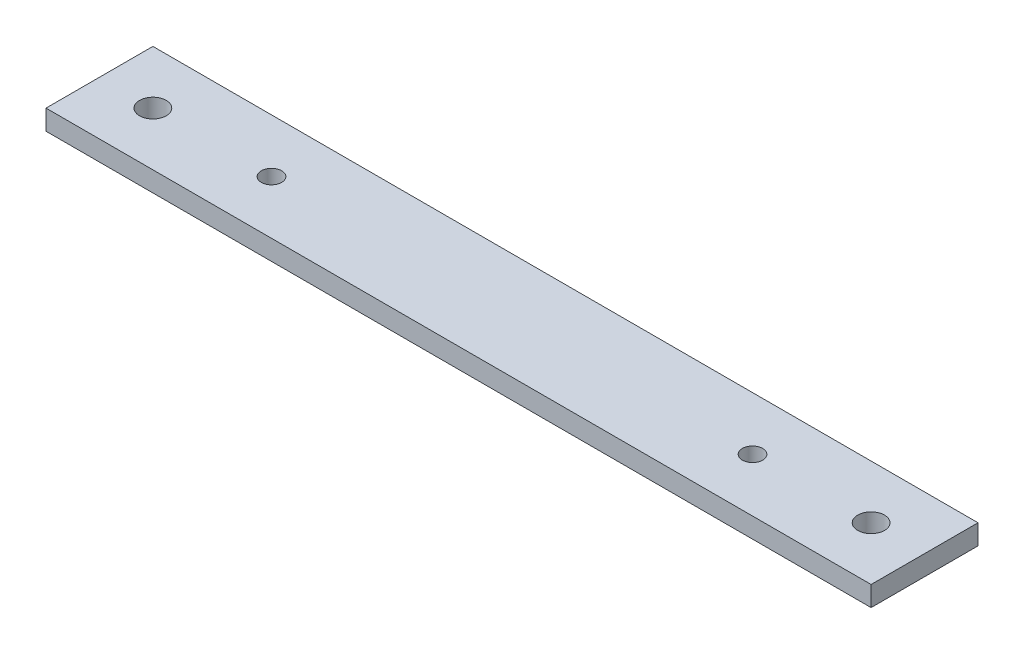
ISO-10303-21;
HEADER;
FILE_DESCRIPTION(('STEP AP214'),'2;1');
FILE_NAME('part.step','',(''),(''),'','','');
FILE_SCHEMA(('AUTOMOTIVE_DESIGN { 1 0 10303 214 1 1 1 1 }'));
ENDSEC;
DATA;
#1=APPLICATION_CONTEXT('core data for automotive mechanical design processes');
#2=APPLICATION_PROTOCOL_DEFINITION('international standard','automotive_design',2000,#1);
#3=PRODUCT_CONTEXT('',#1,'mechanical');
#4=PRODUCT('Part','Part','',(#3));
#5=PRODUCT_RELATED_PRODUCT_CATEGORY('part','',(#4));
#6=PRODUCT_DEFINITION_FORMATION('','',#4);
#7=PRODUCT_DEFINITION_CONTEXT('part definition',#1,'design');
#8=PRODUCT_DEFINITION('design','',#6,#7);
#9=PRODUCT_DEFINITION_SHAPE('','',#8);
#10=(LENGTH_UNIT() NAMED_UNIT(*) SI_UNIT(.MILLI.,.METRE.));
#11=(NAMED_UNIT(*) PLANE_ANGLE_UNIT() SI_UNIT($,.RADIAN.));
#12=(NAMED_UNIT(*) SI_UNIT($,.STERADIAN.) SOLID_ANGLE_UNIT());
#13=UNCERTAINTY_MEASURE_WITH_UNIT(LENGTH_MEASURE(1.E-05),#10,'distance_accuracy_value','');
#14=(GEOMETRIC_REPRESENTATION_CONTEXT(3) GLOBAL_UNCERTAINTY_ASSIGNED_CONTEXT((#13)) GLOBAL_UNIT_ASSIGNED_CONTEXT((#10,
#11,#12)) REPRESENTATION_CONTEXT('',''));
#15=CARTESIAN_POINT('',(0.,0.,0.));
#16=DIRECTION('',(0.,0.,1.));
#17=DIRECTION('',(1.,0.,0.));
#18=AXIS2_PLACEMENT_3D('',#15,#16,#17);
#19=CARTESIAN_POINT('',(-98.0313,4.7625,12.7));
#20=DIRECTION('',(1.,0.,0.));
#21=DIRECTION('',(0.,0.,-1.));
#22=AXIS2_PLACEMENT_3D('',#19,#20,#21);
#23=PLANE('',#22);
#24=DIRECTION('',(0.,0.,1.));
#25=VECTOR('',#24,1.);
#26=CARTESIAN_POINT('',(-98.0313,0.,12.7));
#27=LINE('',#26,#25);
#28=CARTESIAN_POINT('',(-98.0313,0.,-12.7));
#29=VERTEX_POINT('',#28);
#30=CARTESIAN_POINT('',(-98.0313,0.,12.7));
#31=VERTEX_POINT('',#30);
#32=EDGE_CURVE('E96',#29,#31,#27,.T.);
#33=ORIENTED_EDGE('',*,*,#32,.T.);
#34=DIRECTION('',(0.,-1.,0.));
#35=VECTOR('',#34,1.);
#36=CARTESIAN_POINT('',(-98.0313,4.7625,12.7));
#37=LINE('',#36,#35);
#38=CARTESIAN_POINT('',(-98.0313,4.7625,12.7));
#39=VERTEX_POINT('',#38);
#40=EDGE_CURVE('E11',#39,#31,#37,.T.);
#41=ORIENTED_EDGE('',*,*,#40,.F.);
#42=DIRECTION('',(0.,0.,1.));
#43=VECTOR('',#42,1.);
#44=CARTESIAN_POINT('',(-98.0313,4.7625,12.7));
#45=LINE('',#44,#43);
#46=CARTESIAN_POINT('',(-98.0313,4.7625,-12.7));
#47=VERTEX_POINT('',#46);
#48=EDGE_CURVE('E84',#47,#39,#45,.T.);
#49=ORIENTED_EDGE('',*,*,#48,.F.);
#50=DIRECTION('',(0.,-1.,0.));
#51=VECTOR('',#50,1.);
#52=CARTESIAN_POINT('',(-98.0313,4.7625,-12.7));
#53=LINE('',#52,#51);
#54=EDGE_CURVE('E92',#47,#29,#53,.T.);
#55=ORIENTED_EDGE('',*,*,#54,.T.);
#56=EDGE_LOOP('',(#33,#41,#49,#55));
#57=FACE_BOUND('',#56,.T.);
#58=ADVANCED_FACE('F33',(#57),#23,.F.);
#59=CARTESIAN_POINT('',(98.0313,4.7625,12.7));
#60=DIRECTION('',(0.,0.,-1.));
#61=DIRECTION('',(-1.,0.,0.));
#62=AXIS2_PLACEMENT_3D('',#59,#60,#61);
#63=PLANE('',#62);
#64=DIRECTION('',(1.,0.,0.));
#65=VECTOR('',#64,1.);
#66=CARTESIAN_POINT('',(98.0313,0.,12.7));
#67=LINE('',#66,#65);
#68=CARTESIAN_POINT('',(98.0313,0.,12.7));
#69=VERTEX_POINT('',#68);
#70=EDGE_CURVE('E88',#31,#69,#67,.T.);
#71=ORIENTED_EDGE('',*,*,#70,.T.);
#72=DIRECTION('',(0.,-1.,0.));
#73=VECTOR('',#72,1.);
#74=CARTESIAN_POINT('',(98.0313,4.7625,12.7));
#75=LINE('',#74,#73);
#76=CARTESIAN_POINT('',(98.0313,4.7625,12.7));
#77=VERTEX_POINT('',#76);
#78=EDGE_CURVE('E41',#77,#69,#75,.T.);
#79=ORIENTED_EDGE('',*,*,#78,.F.);
#80=DIRECTION('',(1.,0.,0.));
#81=VECTOR('',#80,1.);
#82=CARTESIAN_POINT('',(98.0313,4.7625,12.7));
#83=LINE('',#82,#81);
#84=EDGE_CURVE('E79',#39,#77,#83,.T.);
#85=ORIENTED_EDGE('',*,*,#84,.F.);
#86=ORIENTED_EDGE('',*,*,#40,.T.);
#87=EDGE_LOOP('',(#71,#79,#85,#86));
#88=FACE_BOUND('',#87,.T.);
#89=ADVANCED_FACE('F87',(#88),#63,.F.);
#90=CARTESIAN_POINT('',(98.0313,4.7625,12.7));
#91=DIRECTION('',(-1.,0.,0.));
#92=DIRECTION('',(0.,0.,1.));
#93=AXIS2_PLACEMENT_3D('',#90,#91,#92);
#94=PLANE('',#93);
#95=DIRECTION('',(0.,0.,-1.));
#96=VECTOR('',#95,1.);
#97=CARTESIAN_POINT('',(98.0313,0.,12.7));
#98=LINE('',#97,#96);
#99=CARTESIAN_POINT('',(98.0313,0.,-12.7));
#100=VERTEX_POINT('',#99);
#101=EDGE_CURVE('E66',#69,#100,#98,.T.);
#102=ORIENTED_EDGE('',*,*,#101,.T.);
#103=DIRECTION('',(0.,-1.,0.));
#104=VECTOR('',#103,1.);
#105=CARTESIAN_POINT('',(98.0313,4.7625,-12.7));
#106=LINE('',#105,#104);
#107=CARTESIAN_POINT('',(98.0313,4.7625,-12.7));
#108=VERTEX_POINT('',#107);
#109=EDGE_CURVE('E89',#108,#100,#106,.T.);
#110=ORIENTED_EDGE('',*,*,#109,.F.);
#111=DIRECTION('',(0.,0.,-1.));
#112=VECTOR('',#111,1.);
#113=CARTESIAN_POINT('',(98.0313,4.7625,12.7));
#114=LINE('',#113,#112);
#115=EDGE_CURVE('E82',#77,#108,#114,.T.);
#116=ORIENTED_EDGE('',*,*,#115,.F.);
#117=ORIENTED_EDGE('',*,*,#78,.T.);
#118=EDGE_LOOP('',(#102,#110,#116,#117));
#119=FACE_BOUND('',#118,.T.);
#120=ADVANCED_FACE('F90',(#119),#94,.F.);
#121=CARTESIAN_POINT('',(98.0313,4.7625,-12.7));
#122=DIRECTION('',(0.,0.,1.));
#123=DIRECTION('',(1.,0.,0.));
#124=AXIS2_PLACEMENT_3D('',#121,#122,#123);
#125=PLANE('',#124);
#126=DIRECTION('',(-1.,0.,0.));
#127=VECTOR('',#126,1.);
#128=CARTESIAN_POINT('',(98.0313,0.,-12.7));
#129=LINE('',#128,#127);
#130=EDGE_CURVE('E72',#100,#29,#129,.T.);
#131=ORIENTED_EDGE('',*,*,#130,.T.);
#132=ORIENTED_EDGE('',*,*,#54,.F.);
#133=DIRECTION('',(-1.,0.,0.));
#134=VECTOR('',#133,1.);
#135=CARTESIAN_POINT('',(98.0313,4.7625,-12.7));
#136=LINE('',#135,#134);
#137=EDGE_CURVE('E49',#108,#47,#136,.T.);
#138=ORIENTED_EDGE('',*,*,#137,.F.);
#139=ORIENTED_EDGE('',*,*,#109,.T.);
#140=EDGE_LOOP('',(#131,#132,#138,#139));
#141=FACE_BOUND('',#140,.T.);
#142=ADVANCED_FACE('F104',(#141),#125,.F.);
#143=CARTESIAN_POINT('',(0.,4.7625,0.));
#144=DIRECTION('',(0.,1.,0.));
#145=DIRECTION('',(0.,0.,1.));
#146=AXIS2_PLACEMENT_3D('',#143,#144,#145);
#147=PLANE('',#146);
#148=CARTESIAN_POINT('',(85.3313,4.7625,0.));
#149=DIRECTION('',(0.,1.,0.));
#150=DIRECTION('',(0.,0.,1.));
#151=AXIS2_PLACEMENT_3D('',#148,#149,#150);
#152=CIRCLE('',#151,3.175);
#153=CARTESIAN_POINT('',(85.3313,4.7625,3.17499999999999));
#154=VERTEX_POINT('',#153);
#155=EDGE_CURVE('E116',#154,#154,#152,.T.);
#156=ORIENTED_EDGE('',*,*,#155,.F.);
#157=EDGE_LOOP('',(#156));
#158=FACE_BOUND('',#157,.T.);
#159=CARTESIAN_POINT('',(-85.3313,4.7625,0.));
#160=DIRECTION('',(0.,1.,0.));
#161=DIRECTION('',(0.,0.,1.));
#162=AXIS2_PLACEMENT_3D('',#159,#160,#161);
#163=CIRCLE('',#162,3.175);
#164=CARTESIAN_POINT('',(-85.3313,4.7625,3.175));
#165=VERTEX_POINT('',#164);
#166=EDGE_CURVE('E122',#165,#165,#163,.T.);
#167=ORIENTED_EDGE('',*,*,#166,.F.);
#168=EDGE_LOOP('',(#167));
#169=FACE_BOUND('',#168,.T.);
#170=CARTESIAN_POINT('',(57.15,4.7625,0.));
#171=DIRECTION('',(0.,1.,0.));
#172=DIRECTION('',(0.,0.,1.));
#173=AXIS2_PLACEMENT_3D('',#170,#171,#172);
#174=CIRCLE('',#173,2.413);
#175=CARTESIAN_POINT('',(57.15,4.7625,2.413));
#176=VERTEX_POINT('',#175);
#177=EDGE_CURVE('E128',#176,#176,#174,.T.);
#178=ORIENTED_EDGE('',*,*,#177,.F.);
#179=EDGE_LOOP('',(#178));
#180=FACE_BOUND('',#179,.T.);
#181=CARTESIAN_POINT('',(-57.15,4.7625,0.));
#182=DIRECTION('',(0.,1.,0.));
#183=DIRECTION('',(0.,0.,1.));
#184=AXIS2_PLACEMENT_3D('',#181,#182,#183);
#185=CIRCLE('',#184,2.413);
#186=CARTESIAN_POINT('',(-57.15,4.7625,2.413));
#187=VERTEX_POINT('',#186);
#188=EDGE_CURVE('E110',#187,#187,#185,.T.);
#189=ORIENTED_EDGE('',*,*,#188,.F.);
#190=EDGE_LOOP('',(#189));
#191=FACE_BOUND('',#190,.T.);
#192=ORIENTED_EDGE('',*,*,#48,.T.);
#193=ORIENTED_EDGE('',*,*,#84,.T.);
#194=ORIENTED_EDGE('',*,*,#115,.T.);
#195=ORIENTED_EDGE('',*,*,#137,.T.);
#196=EDGE_LOOP('',(#192,#193,#194,#195));
#197=FACE_BOUND('',#196,.T.);
#198=ADVANCED_FACE('F80',(#158,#169,#180,#191,#197),#147,.T.);
#199=CARTESIAN_POINT('',(0.,0.,0.));
#200=DIRECTION('',(0.,1.,0.));
#201=DIRECTION('',(0.,0.,1.));
#202=AXIS2_PLACEMENT_3D('',#199,#200,#201);
#203=PLANE('',#202);
#204=CARTESIAN_POINT('',(85.3313,0.,0.));
#205=DIRECTION('',(0.,1.,0.));
#206=DIRECTION('',(0.,0.,1.));
#207=AXIS2_PLACEMENT_3D('',#204,#205,#206);
#208=CIRCLE('',#207,3.175);
#209=CARTESIAN_POINT('',(85.3313,0.,3.17499999999999));
#210=VERTEX_POINT('',#209);
#211=EDGE_CURVE('E119',#210,#210,#208,.T.);
#212=ORIENTED_EDGE('',*,*,#211,.T.);
#213=EDGE_LOOP('',(#212));
#214=FACE_BOUND('',#213,.T.);
#215=CARTESIAN_POINT('',(-85.3313,0.,0.));
#216=DIRECTION('',(0.,1.,0.));
#217=DIRECTION('',(0.,0.,1.));
#218=AXIS2_PLACEMENT_3D('',#215,#216,#217);
#219=CIRCLE('',#218,3.175);
#220=CARTESIAN_POINT('',(-85.3313,0.,3.175));
#221=VERTEX_POINT('',#220);
#222=EDGE_CURVE('E125',#221,#221,#219,.T.);
#223=ORIENTED_EDGE('',*,*,#222,.T.);
#224=EDGE_LOOP('',(#223));
#225=FACE_BOUND('',#224,.T.);
#226=CARTESIAN_POINT('',(57.15,0.,0.));
#227=DIRECTION('',(0.,1.,0.));
#228=DIRECTION('',(0.,0.,1.));
#229=AXIS2_PLACEMENT_3D('',#226,#227,#228);
#230=CIRCLE('',#229,2.413);
#231=CARTESIAN_POINT('',(57.15,0.,2.413));
#232=VERTEX_POINT('',#231);
#233=EDGE_CURVE('E113',#232,#232,#230,.T.);
#234=ORIENTED_EDGE('',*,*,#233,.T.);
#235=EDGE_LOOP('',(#234));
#236=FACE_BOUND('',#235,.T.);
#237=CARTESIAN_POINT('',(-57.15,0.,0.));
#238=DIRECTION('',(0.,1.,0.));
#239=DIRECTION('',(0.,0.,1.));
#240=AXIS2_PLACEMENT_3D('',#237,#238,#239);
#241=CIRCLE('',#240,2.413);
#242=CARTESIAN_POINT('',(-57.15,0.,2.413));
#243=VERTEX_POINT('',#242);
#244=EDGE_CURVE('E99',#243,#243,#241,.T.);
#245=ORIENTED_EDGE('',*,*,#244,.T.);
#246=EDGE_LOOP('',(#245));
#247=FACE_BOUND('',#246,.T.);
#248=ORIENTED_EDGE('',*,*,#32,.F.);
#249=ORIENTED_EDGE('',*,*,#130,.F.);
#250=ORIENTED_EDGE('',*,*,#101,.F.);
#251=ORIENTED_EDGE('',*,*,#70,.F.);
#252=EDGE_LOOP('',(#248,#249,#250,#251));
#253=FACE_BOUND('',#252,.T.);
#254=ADVANCED_FACE('F107',(#214,#225,#236,#247,#253),#203,.F.);
#255=CARTESIAN_POINT('',(-57.15,0.,0.));
#256=DIRECTION('',(0.,1.,0.));
#257=DIRECTION('',(0.,0.,1.));
#258=AXIS2_PLACEMENT_3D('',#255,#256,#257);
#259=CYLINDRICAL_SURFACE('',#258,2.413);
#260=CARTESIAN_POINT('',(-57.15,0.,2.413));
#261=CARTESIAN_POINT('',(-57.15,0.049609375,2.413));
#262=CARTESIAN_POINT('',(-57.15,0.09921875,2.413));
#263=CARTESIAN_POINT('',(-57.15,0.1984375,2.413));
#264=CARTESIAN_POINT('',(-57.15,0.248046875,2.413));
#265=CARTESIAN_POINT('',(-57.15,0.347265625,2.413));
#266=CARTESIAN_POINT('',(-57.15,0.396875,2.413));
#267=CARTESIAN_POINT('',(-57.15,0.49609375,2.413));
#268=CARTESIAN_POINT('',(-57.15,0.545703125,2.413));
#269=CARTESIAN_POINT('',(-57.15,0.644921875,2.413));
#270=CARTESIAN_POINT('',(-57.15,0.69453125,2.413));
#271=CARTESIAN_POINT('',(-57.15,0.79375,2.413));
#272=CARTESIAN_POINT('',(-57.15,0.843359375,2.413));
#273=CARTESIAN_POINT('',(-57.15,0.942578125,2.413));
#274=CARTESIAN_POINT('',(-57.15,0.9921875,2.413));
#275=CARTESIAN_POINT('',(-57.15,1.09140625,2.413));
#276=CARTESIAN_POINT('',(-57.15,1.141015625,2.413));
#277=CARTESIAN_POINT('',(-57.15,1.240234375,2.413));
#278=CARTESIAN_POINT('',(-57.15,1.28984375,2.413));
#279=CARTESIAN_POINT('',(-57.15,1.3890625,2.413));
#280=CARTESIAN_POINT('',(-57.15,1.438671875,2.413));
#281=CARTESIAN_POINT('',(-57.15,1.537890625,2.413));
#282=CARTESIAN_POINT('',(-57.15,1.5875,2.413));
#283=CARTESIAN_POINT('',(-57.15,1.68671875,2.413));
#284=CARTESIAN_POINT('',(-57.15,1.736328125,2.413));
#285=CARTESIAN_POINT('',(-57.15,1.835546875,2.413));
#286=CARTESIAN_POINT('',(-57.15,1.88515625,2.413));
#287=CARTESIAN_POINT('',(-57.15,1.984375,2.413));
#288=CARTESIAN_POINT('',(-57.15,2.033984375,2.413));
#289=CARTESIAN_POINT('',(-57.15,2.133203125,2.413));
#290=CARTESIAN_POINT('',(-57.15,2.1828125,2.413));
#291=CARTESIAN_POINT('',(-57.15,2.28203125,2.413));
#292=CARTESIAN_POINT('',(-57.15,2.331640625,2.413));
#293=CARTESIAN_POINT('',(-57.15,2.430859375,2.413));
#294=CARTESIAN_POINT('',(-57.15,2.48046875,2.413));
#295=CARTESIAN_POINT('',(-57.15,2.5796875,2.413));
#296=CARTESIAN_POINT('',(-57.15,2.629296875,2.413));
#297=CARTESIAN_POINT('',(-57.15,2.728515625,2.413));
#298=CARTESIAN_POINT('',(-57.15,2.778125,2.413));
#299=CARTESIAN_POINT('',(-57.15,2.87734375,2.413));
#300=CARTESIAN_POINT('',(-57.15,2.926953125,2.413));
#301=CARTESIAN_POINT('',(-57.15,3.026171875,2.413));
#302=CARTESIAN_POINT('',(-57.15,3.07578125,2.413));
#303=CARTESIAN_POINT('',(-57.15,3.175,2.413));
#304=CARTESIAN_POINT('',(-57.15,3.224609375,2.413));
#305=CARTESIAN_POINT('',(-57.15,3.323828125,2.413));
#306=CARTESIAN_POINT('',(-57.15,3.3734375,2.413));
#307=CARTESIAN_POINT('',(-57.15,3.47265625,2.413));
#308=CARTESIAN_POINT('',(-57.15,3.522265625,2.413));
#309=CARTESIAN_POINT('',(-57.15,3.621484375,2.413));
#310=CARTESIAN_POINT('',(-57.15,3.67109375,2.413));
#311=CARTESIAN_POINT('',(-57.15,3.7703125,2.413));
#312=CARTESIAN_POINT('',(-57.15,3.819921875,2.413));
#313=CARTESIAN_POINT('',(-57.15,3.919140625,2.413));
#314=CARTESIAN_POINT('',(-57.15,3.96875,2.413));
#315=CARTESIAN_POINT('',(-57.15,4.06796875,2.413));
#316=CARTESIAN_POINT('',(-57.15,4.117578125,2.413));
#317=CARTESIAN_POINT('',(-57.15,4.216796875,2.413));
#318=CARTESIAN_POINT('',(-57.15,4.26640625,2.413));
#319=CARTESIAN_POINT('',(-57.15,4.365625,2.413));
#320=CARTESIAN_POINT('',(-57.15,4.415234375,2.413));
#321=CARTESIAN_POINT('',(-57.15,4.514453125,2.413));
#322=CARTESIAN_POINT('',(-57.15,4.5640625,2.413));
#323=CARTESIAN_POINT('',(-57.15,4.66328125,2.413));
#324=CARTESIAN_POINT('',(-57.15,4.712890625,2.413));
#325=CARTESIAN_POINT('',(-57.15,4.7625,2.413));
#326=B_SPLINE_CURVE_WITH_KNOTS('',3,(#260,#261,#262,#263,#264,#265,#266,#267,#268,#269,#270,
#271,#272,#273,#274,#275,#276,#277,#278,#279,#280,#281,#282,#283,#284,#285,#286,#287,#288,#289,
#290,#291,#292,#293,#294,#295,#296,#297,#298,#299,#300,#301,#302,#303,#304,#305,#306,#307,#308,
#309,#310,#311,#312,#313,#314,#315,#316,#317,#318,#319,#320,#321,#322,#323,#324,#325),
.UNSPECIFIED.,.F.,.F.,(4,2,2,2,2,2,2,2,2,2,2,2,2,2,2,2,2,2,2,2,2,2,2,2,2,2,2,2,2,2,2,2,4),(0.,
0.148828125,0.29765625,0.446484375,0.5953125,0.744140625,0.89296875,1.041796875,1.190625,
1.339453125,1.48828125,1.637109375,1.7859375,1.934765625,2.08359375,2.232421875,2.38125,
2.530078125,2.67890625,2.827734375,2.9765625,3.125390625,3.27421875,3.423046875,3.571875,
3.720703125,3.86953125,4.018359375,4.1671875,4.316015625,4.46484375,4.613671875,4.7625),.UNSPECIFIED.);
#327=EDGE_CURVE('BSEAM140',#243,#187,#326,.T.);
#328=ORIENTED_EDGE('',*,*,#244,.F.);
#329=ORIENTED_EDGE('',*,*,#188,.T.);
#330=ORIENTED_EDGE('',*,*,#327,.T.);
#331=ORIENTED_EDGE('',*,*,#327,.F.);
#332=EDGE_LOOP('',(#328,#330,#329,#331));
#333=FACE_BOUND('',#332,.T.);
#334=ADVANCED_FACE('F140',(#333),#259,.F.);
#335=CARTESIAN_POINT('',(57.15,0.,0.));
#336=DIRECTION('',(0.,1.,0.));
#337=DIRECTION('',(0.,0.,1.));
#338=AXIS2_PLACEMENT_3D('',#335,#336,#337);
#339=CYLINDRICAL_SURFACE('',#338,2.413);
#340=CARTESIAN_POINT('',(57.15,0.,2.413));
#341=CARTESIAN_POINT('',(57.15,0.049609375,2.413));
#342=CARTESIAN_POINT('',(57.15,0.09921875,2.413));
#343=CARTESIAN_POINT('',(57.15,0.1984375,2.413));
#344=CARTESIAN_POINT('',(57.15,0.248046875,2.413));
#345=CARTESIAN_POINT('',(57.15,0.347265625,2.413));
#346=CARTESIAN_POINT('',(57.15,0.396875,2.413));
#347=CARTESIAN_POINT('',(57.15,0.49609375,2.413));
#348=CARTESIAN_POINT('',(57.15,0.545703125,2.413));
#349=CARTESIAN_POINT('',(57.15,0.644921875,2.413));
#350=CARTESIAN_POINT('',(57.15,0.69453125,2.413));
#351=CARTESIAN_POINT('',(57.15,0.79375,2.413));
#352=CARTESIAN_POINT('',(57.15,0.843359375,2.413));
#353=CARTESIAN_POINT('',(57.15,0.942578125,2.413));
#354=CARTESIAN_POINT('',(57.15,0.9921875,2.413));
#355=CARTESIAN_POINT('',(57.15,1.09140625,2.413));
#356=CARTESIAN_POINT('',(57.15,1.141015625,2.413));
#357=CARTESIAN_POINT('',(57.15,1.240234375,2.413));
#358=CARTESIAN_POINT('',(57.15,1.28984375,2.413));
#359=CARTESIAN_POINT('',(57.15,1.3890625,2.413));
#360=CARTESIAN_POINT('',(57.15,1.438671875,2.413));
#361=CARTESIAN_POINT('',(57.15,1.537890625,2.413));
#362=CARTESIAN_POINT('',(57.15,1.5875,2.413));
#363=CARTESIAN_POINT('',(57.15,1.68671875,2.413));
#364=CARTESIAN_POINT('',(57.15,1.736328125,2.413));
#365=CARTESIAN_POINT('',(57.15,1.835546875,2.413));
#366=CARTESIAN_POINT('',(57.15,1.88515625,2.413));
#367=CARTESIAN_POINT('',(57.15,1.984375,2.413));
#368=CARTESIAN_POINT('',(57.15,2.033984375,2.413));
#369=CARTESIAN_POINT('',(57.15,2.133203125,2.413));
#370=CARTESIAN_POINT('',(57.15,2.1828125,2.413));
#371=CARTESIAN_POINT('',(57.15,2.28203125,2.413));
#372=CARTESIAN_POINT('',(57.15,2.331640625,2.413));
#373=CARTESIAN_POINT('',(57.15,2.430859375,2.413));
#374=CARTESIAN_POINT('',(57.15,2.48046875,2.413));
#375=CARTESIAN_POINT('',(57.15,2.5796875,2.413));
#376=CARTESIAN_POINT('',(57.15,2.629296875,2.413));
#377=CARTESIAN_POINT('',(57.15,2.728515625,2.413));
#378=CARTESIAN_POINT('',(57.15,2.778125,2.413));
#379=CARTESIAN_POINT('',(57.15,2.87734375,2.413));
#380=CARTESIAN_POINT('',(57.15,2.926953125,2.413));
#381=CARTESIAN_POINT('',(57.15,3.026171875,2.413));
#382=CARTESIAN_POINT('',(57.15,3.07578125,2.413));
#383=CARTESIAN_POINT('',(57.15,3.175,2.413));
#384=CARTESIAN_POINT('',(57.15,3.224609375,2.413));
#385=CARTESIAN_POINT('',(57.15,3.323828125,2.413));
#386=CARTESIAN_POINT('',(57.15,3.3734375,2.413));
#387=CARTESIAN_POINT('',(57.15,3.47265625,2.413));
#388=CARTESIAN_POINT('',(57.15,3.522265625,2.413));
#389=CARTESIAN_POINT('',(57.15,3.621484375,2.413));
#390=CARTESIAN_POINT('',(57.15,3.67109375,2.413));
#391=CARTESIAN_POINT('',(57.15,3.7703125,2.413));
#392=CARTESIAN_POINT('',(57.15,3.819921875,2.413));
#393=CARTESIAN_POINT('',(57.15,3.919140625,2.413));
#394=CARTESIAN_POINT('',(57.15,3.96875,2.413));
#395=CARTESIAN_POINT('',(57.15,4.06796875,2.413));
#396=CARTESIAN_POINT('',(57.15,4.117578125,2.413));
#397=CARTESIAN_POINT('',(57.15,4.216796875,2.413));
#398=CARTESIAN_POINT('',(57.15,4.26640625,2.413));
#399=CARTESIAN_POINT('',(57.15,4.365625,2.413));
#400=CARTESIAN_POINT('',(57.15,4.415234375,2.413));
#401=CARTESIAN_POINT('',(57.15,4.514453125,2.413));
#402=CARTESIAN_POINT('',(57.15,4.5640625,2.413));
#403=CARTESIAN_POINT('',(57.15,4.66328125,2.413));
#404=CARTESIAN_POINT('',(57.15,4.712890625,2.413));
#405=CARTESIAN_POINT('',(57.15,4.7625,2.413));
#406=B_SPLINE_CURVE_WITH_KNOTS('',3,(#340,#341,#342,#343,#344,#345,#346,#347,#348,#349,#350,
#351,#352,#353,#354,#355,#356,#357,#358,#359,#360,#361,#362,#363,#364,#365,#366,#367,#368,#369,
#370,#371,#372,#373,#374,#375,#376,#377,#378,#379,#380,#381,#382,#383,#384,#385,#386,#387,#388,
#389,#390,#391,#392,#393,#394,#395,#396,#397,#398,#399,#400,#401,#402,#403,#404,#405),
.UNSPECIFIED.,.F.,.F.,(4,2,2,2,2,2,2,2,2,2,2,2,2,2,2,2,2,2,2,2,2,2,2,2,2,2,2,2,2,2,2,2,4),(0.,
0.148828125,0.29765625,0.446484375,0.5953125,0.744140625,0.89296875,1.041796875,1.190625,
1.339453125,1.48828125,1.637109375,1.7859375,1.934765625,2.08359375,2.232421875,2.38125,
2.530078125,2.67890625,2.827734375,2.9765625,3.125390625,3.27421875,3.423046875,3.571875,
3.720703125,3.86953125,4.018359375,4.1671875,4.316015625,4.46484375,4.613671875,4.7625),.UNSPECIFIED.);
#407=EDGE_CURVE('BSEAM136',#232,#176,#406,.T.);
#408=ORIENTED_EDGE('',*,*,#233,.F.);
#409=ORIENTED_EDGE('',*,*,#177,.T.);
#410=ORIENTED_EDGE('',*,*,#407,.T.);
#411=ORIENTED_EDGE('',*,*,#407,.F.);
#412=EDGE_LOOP('',(#408,#410,#409,#411));
#413=FACE_BOUND('',#412,.T.);
#414=ADVANCED_FACE('F136',(#413),#339,.F.);
#415=CARTESIAN_POINT('',(-85.3313,0.,0.));
#416=DIRECTION('',(0.,1.,0.));
#417=DIRECTION('',(0.,0.,1.));
#418=AXIS2_PLACEMENT_3D('',#415,#416,#417);
#419=CYLINDRICAL_SURFACE('',#418,3.175);
#420=CARTESIAN_POINT('',(-85.3313,0.,3.175));
#421=CARTESIAN_POINT('',(-85.3313,0.049609375,3.175));
#422=CARTESIAN_POINT('',(-85.3313,0.09921875,3.175));
#423=CARTESIAN_POINT('',(-85.3313,0.1984375,3.175));
#424=CARTESIAN_POINT('',(-85.3313,0.248046875,3.175));
#425=CARTESIAN_POINT('',(-85.3313,0.347265625,3.175));
#426=CARTESIAN_POINT('',(-85.3313,0.396875,3.175));
#427=CARTESIAN_POINT('',(-85.3313,0.49609375,3.175));
#428=CARTESIAN_POINT('',(-85.3313,0.545703125,3.175));
#429=CARTESIAN_POINT('',(-85.3313,0.644921875,3.175));
#430=CARTESIAN_POINT('',(-85.3313,0.69453125,3.175));
#431=CARTESIAN_POINT('',(-85.3313,0.79375,3.175));
#432=CARTESIAN_POINT('',(-85.3313,0.843359375,3.175));
#433=CARTESIAN_POINT('',(-85.3313,0.942578125,3.175));
#434=CARTESIAN_POINT('',(-85.3313,0.9921875,3.175));
#435=CARTESIAN_POINT('',(-85.3313,1.09140625,3.175));
#436=CARTESIAN_POINT('',(-85.3313,1.141015625,3.175));
#437=CARTESIAN_POINT('',(-85.3313,1.240234375,3.175));
#438=CARTESIAN_POINT('',(-85.3313,1.28984375,3.175));
#439=CARTESIAN_POINT('',(-85.3313,1.3890625,3.175));
#440=CARTESIAN_POINT('',(-85.3313,1.438671875,3.175));
#441=CARTESIAN_POINT('',(-85.3313,1.537890625,3.175));
#442=CARTESIAN_POINT('',(-85.3313,1.5875,3.175));
#443=CARTESIAN_POINT('',(-85.3313,1.68671875,3.175));
#444=CARTESIAN_POINT('',(-85.3313,1.736328125,3.175));
#445=CARTESIAN_POINT('',(-85.3313,1.835546875,3.175));
#446=CARTESIAN_POINT('',(-85.3313,1.88515625,3.175));
#447=CARTESIAN_POINT('',(-85.3313,1.984375,3.175));
#448=CARTESIAN_POINT('',(-85.3313,2.033984375,3.175));
#449=CARTESIAN_POINT('',(-85.3313,2.133203125,3.175));
#450=CARTESIAN_POINT('',(-85.3313,2.1828125,3.175));
#451=CARTESIAN_POINT('',(-85.3313,2.28203125,3.175));
#452=CARTESIAN_POINT('',(-85.3313,2.331640625,3.175));
#453=CARTESIAN_POINT('',(-85.3313,2.430859375,3.175));
#454=CARTESIAN_POINT('',(-85.3313,2.48046875,3.175));
#455=CARTESIAN_POINT('',(-85.3313,2.5796875,3.175));
#456=CARTESIAN_POINT('',(-85.3313,2.629296875,3.175));
#457=CARTESIAN_POINT('',(-85.3313,2.728515625,3.175));
#458=CARTESIAN_POINT('',(-85.3313,2.778125,3.175));
#459=CARTESIAN_POINT('',(-85.3313,2.87734375,3.175));
#460=CARTESIAN_POINT('',(-85.3313,2.926953125,3.175));
#461=CARTESIAN_POINT('',(-85.3313,3.026171875,3.175));
#462=CARTESIAN_POINT('',(-85.3313,3.07578125,3.175));
#463=CARTESIAN_POINT('',(-85.3313,3.175,3.175));
#464=CARTESIAN_POINT('',(-85.3313,3.224609375,3.175));
#465=CARTESIAN_POINT('',(-85.3313,3.323828125,3.175));
#466=CARTESIAN_POINT('',(-85.3313,3.3734375,3.175));
#467=CARTESIAN_POINT('',(-85.3313,3.47265625,3.175));
#468=CARTESIAN_POINT('',(-85.3313,3.522265625,3.175));
#469=CARTESIAN_POINT('',(-85.3313,3.621484375,3.175));
#470=CARTESIAN_POINT('',(-85.3313,3.67109375,3.175));
#471=CARTESIAN_POINT('',(-85.3313,3.7703125,3.175));
#472=CARTESIAN_POINT('',(-85.3313,3.819921875,3.175));
#473=CARTESIAN_POINT('',(-85.3313,3.919140625,3.175));
#474=CARTESIAN_POINT('',(-85.3313,3.96875,3.175));
#475=CARTESIAN_POINT('',(-85.3313,4.06796875,3.175));
#476=CARTESIAN_POINT('',(-85.3313,4.117578125,3.175));
#477=CARTESIAN_POINT('',(-85.3313,4.216796875,3.175));
#478=CARTESIAN_POINT('',(-85.3313,4.26640625,3.175));
#479=CARTESIAN_POINT('',(-85.3313,4.365625,3.175));
#480=CARTESIAN_POINT('',(-85.3313,4.415234375,3.175));
#481=CARTESIAN_POINT('',(-85.3313,4.514453125,3.175));
#482=CARTESIAN_POINT('',(-85.3313,4.5640625,3.175));
#483=CARTESIAN_POINT('',(-85.3313,4.66328125,3.175));
#484=CARTESIAN_POINT('',(-85.3313,4.712890625,3.175));
#485=CARTESIAN_POINT('',(-85.3313,4.7625,3.175));
#486=B_SPLINE_CURVE_WITH_KNOTS('',3,(#420,#421,#422,#423,#424,#425,#426,#427,#428,#429,#430,
#431,#432,#433,#434,#435,#436,#437,#438,#439,#440,#441,#442,#443,#444,#445,#446,#447,#448,#449,
#450,#451,#452,#453,#454,#455,#456,#457,#458,#459,#460,#461,#462,#463,#464,#465,#466,#467,#468,
#469,#470,#471,#472,#473,#474,#475,#476,#477,#478,#479,#480,#481,#482,#483,#484,#485),
.UNSPECIFIED.,.F.,.F.,(4,2,2,2,2,2,2,2,2,2,2,2,2,2,2,2,2,2,2,2,2,2,2,2,2,2,2,2,2,2,2,2,4),(0.,
0.148828125,0.29765625,0.446484375,0.5953125,0.744140625,0.89296875,1.041796875,1.190625,
1.339453125,1.48828125,1.637109375,1.7859375,1.934765625,2.08359375,2.232421875,2.38125,
2.530078125,2.67890625,2.827734375,2.9765625,3.125390625,3.27421875,3.423046875,3.571875,
3.720703125,3.86953125,4.018359375,4.1671875,4.316015625,4.46484375,4.613671875,4.7625),.UNSPECIFIED.);
#487=EDGE_CURVE('BSEAM139',#221,#165,#486,.T.);
#488=ORIENTED_EDGE('',*,*,#222,.F.);
#489=ORIENTED_EDGE('',*,*,#166,.T.);
#490=ORIENTED_EDGE('',*,*,#487,.T.);
#491=ORIENTED_EDGE('',*,*,#487,.F.);
#492=EDGE_LOOP('',(#488,#490,#489,#491));
#493=FACE_BOUND('',#492,.T.);
#494=ADVANCED_FACE('F139',(#493),#419,.F.);
#495=CARTESIAN_POINT('',(85.3313,0.,0.));
#496=DIRECTION('',(0.,1.,0.));
#497=DIRECTION('',(0.,0.,1.));
#498=AXIS2_PLACEMENT_3D('',#495,#496,#497);
#499=CYLINDRICAL_SURFACE('',#498,3.175);
#500=CARTESIAN_POINT('',(85.3313,0.,3.17499999999999));
#501=CARTESIAN_POINT('',(85.3313,0.049609375,3.17499999999999));
#502=CARTESIAN_POINT('',(85.3313,0.09921875,3.17499999999999));
#503=CARTESIAN_POINT('',(85.3313,0.1984375,3.17499999999999));
#504=CARTESIAN_POINT('',(85.3313,0.248046875,3.17499999999999));
#505=CARTESIAN_POINT('',(85.3313,0.347265625,3.17499999999999));
#506=CARTESIAN_POINT('',(85.3313,0.396875,3.17499999999999));
#507=CARTESIAN_POINT('',(85.3313,0.49609375,3.17499999999999));
#508=CARTESIAN_POINT('',(85.3313,0.545703125,3.17499999999999));
#509=CARTESIAN_POINT('',(85.3313,0.644921875,3.17499999999999));
#510=CARTESIAN_POINT('',(85.3313,0.69453125,3.17499999999999));
#511=CARTESIAN_POINT('',(85.3313,0.79375,3.17499999999999));
#512=CARTESIAN_POINT('',(85.3313,0.843359375,3.17499999999999));
#513=CARTESIAN_POINT('',(85.3313,0.942578125,3.17499999999999));
#514=CARTESIAN_POINT('',(85.3313,0.9921875,3.17499999999999));
#515=CARTESIAN_POINT('',(85.3313,1.09140625,3.17499999999999));
#516=CARTESIAN_POINT('',(85.3313,1.141015625,3.17499999999999));
#517=CARTESIAN_POINT('',(85.3313,1.240234375,3.17499999999999));
#518=CARTESIAN_POINT('',(85.3313,1.28984375,3.17499999999999));
#519=CARTESIAN_POINT('',(85.3313,1.3890625,3.17499999999999));
#520=CARTESIAN_POINT('',(85.3313,1.438671875,3.17499999999999));
#521=CARTESIAN_POINT('',(85.3313,1.537890625,3.17499999999999));
#522=CARTESIAN_POINT('',(85.3313,1.5875,3.17499999999999));
#523=CARTESIAN_POINT('',(85.3313,1.68671875,3.17499999999999));
#524=CARTESIAN_POINT('',(85.3313,1.736328125,3.17499999999999));
#525=CARTESIAN_POINT('',(85.3313,1.835546875,3.17499999999999));
#526=CARTESIAN_POINT('',(85.3313,1.88515625,3.17499999999999));
#527=CARTESIAN_POINT('',(85.3313,1.984375,3.17499999999999));
#528=CARTESIAN_POINT('',(85.3313,2.033984375,3.17499999999999));
#529=CARTESIAN_POINT('',(85.3313,2.133203125,3.17499999999999));
#530=CARTESIAN_POINT('',(85.3313,2.1828125,3.17499999999999));
#531=CARTESIAN_POINT('',(85.3313,2.28203125,3.17499999999999));
#532=CARTESIAN_POINT('',(85.3313,2.331640625,3.17499999999999));
#533=CARTESIAN_POINT('',(85.3313,2.430859375,3.17499999999999));
#534=CARTESIAN_POINT('',(85.3313,2.48046875,3.17499999999999));
#535=CARTESIAN_POINT('',(85.3313,2.5796875,3.17499999999999));
#536=CARTESIAN_POINT('',(85.3313,2.629296875,3.17499999999999));
#537=CARTESIAN_POINT('',(85.3313,2.728515625,3.17499999999999));
#538=CARTESIAN_POINT('',(85.3313,2.778125,3.17499999999999));
#539=CARTESIAN_POINT('',(85.3313,2.87734375,3.17499999999999));
#540=CARTESIAN_POINT('',(85.3313,2.926953125,3.17499999999999));
#541=CARTESIAN_POINT('',(85.3313,3.026171875,3.17499999999999));
#542=CARTESIAN_POINT('',(85.3313,3.07578125,3.17499999999999));
#543=CARTESIAN_POINT('',(85.3313,3.175,3.17499999999999));
#544=CARTESIAN_POINT('',(85.3313,3.224609375,3.17499999999999));
#545=CARTESIAN_POINT('',(85.3313,3.323828125,3.17499999999999));
#546=CARTESIAN_POINT('',(85.3313,3.3734375,3.17499999999999));
#547=CARTESIAN_POINT('',(85.3313,3.47265625,3.17499999999999));
#548=CARTESIAN_POINT('',(85.3313,3.522265625,3.17499999999999));
#549=CARTESIAN_POINT('',(85.3313,3.621484375,3.17499999999999));
#550=CARTESIAN_POINT('',(85.3313,3.67109375,3.17499999999999));
#551=CARTESIAN_POINT('',(85.3313,3.7703125,3.17499999999999));
#552=CARTESIAN_POINT('',(85.3313,3.819921875,3.17499999999999));
#553=CARTESIAN_POINT('',(85.3313,3.919140625,3.17499999999999));
#554=CARTESIAN_POINT('',(85.3313,3.96875,3.17499999999999));
#555=CARTESIAN_POINT('',(85.3313,4.06796875,3.17499999999999));
#556=CARTESIAN_POINT('',(85.3313,4.117578125,3.17499999999999));
#557=CARTESIAN_POINT('',(85.3313,4.216796875,3.17499999999999));
#558=CARTESIAN_POINT('',(85.3313,4.26640625,3.17499999999999));
#559=CARTESIAN_POINT('',(85.3313,4.365625,3.17499999999999));
#560=CARTESIAN_POINT('',(85.3313,4.415234375,3.17499999999999));
#561=CARTESIAN_POINT('',(85.3313,4.514453125,3.17499999999999));
#562=CARTESIAN_POINT('',(85.3313,4.5640625,3.17499999999999));
#563=CARTESIAN_POINT('',(85.3313,4.66328125,3.17499999999999));
#564=CARTESIAN_POINT('',(85.3313,4.712890625,3.17499999999999));
#565=CARTESIAN_POINT('',(85.3313,4.7625,3.17499999999999));
#566=B_SPLINE_CURVE_WITH_KNOTS('',3,(#500,#501,#502,#503,#504,#505,#506,#507,#508,#509,#510,
#511,#512,#513,#514,#515,#516,#517,#518,#519,#520,#521,#522,#523,#524,#525,#526,#527,#528,#529,
#530,#531,#532,#533,#534,#535,#536,#537,#538,#539,#540,#541,#542,#543,#544,#545,#546,#547,#548,
#549,#550,#551,#552,#553,#554,#555,#556,#557,#558,#559,#560,#561,#562,#563,#564,#565),
.UNSPECIFIED.,.F.,.F.,(4,2,2,2,2,2,2,2,2,2,2,2,2,2,2,2,2,2,2,2,2,2,2,2,2,2,2,2,2,2,2,2,4),(0.,
0.148828125,0.29765625,0.446484375,0.5953125,0.744140625,0.89296875,1.041796875,1.190625,
1.339453125,1.48828125,1.637109375,1.7859375,1.934765625,2.08359375,2.232421875,2.38125,
2.530078125,2.67890625,2.827734375,2.9765625,3.125390625,3.27421875,3.423046875,3.571875,
3.720703125,3.86953125,4.018359375,4.1671875,4.316015625,4.46484375,4.613671875,4.7625),.UNSPECIFIED.);
#567=EDGE_CURVE('BSEAM201',#210,#154,#566,.T.);
#568=ORIENTED_EDGE('',*,*,#211,.F.);
#569=ORIENTED_EDGE('',*,*,#155,.T.);
#570=ORIENTED_EDGE('',*,*,#567,.T.);
#571=ORIENTED_EDGE('',*,*,#567,.F.);
#572=EDGE_LOOP('',(#568,#570,#569,#571));
#573=FACE_BOUND('',#572,.T.);
#574=ADVANCED_FACE('F201',(#573),#499,.F.);
#575=CLOSED_SHELL('',(#58,#89,#120,#142,#198,#254,#334,#414,#494,#574));
#576=MANIFOLD_SOLID_BREP('B2',#575);
#577=ADVANCED_BREP_SHAPE_REPRESENTATION('',(#18,#576),#14);
#578=SHAPE_DEFINITION_REPRESENTATION(#9,#577);
ENDSEC;
END-ISO-10303-21;
